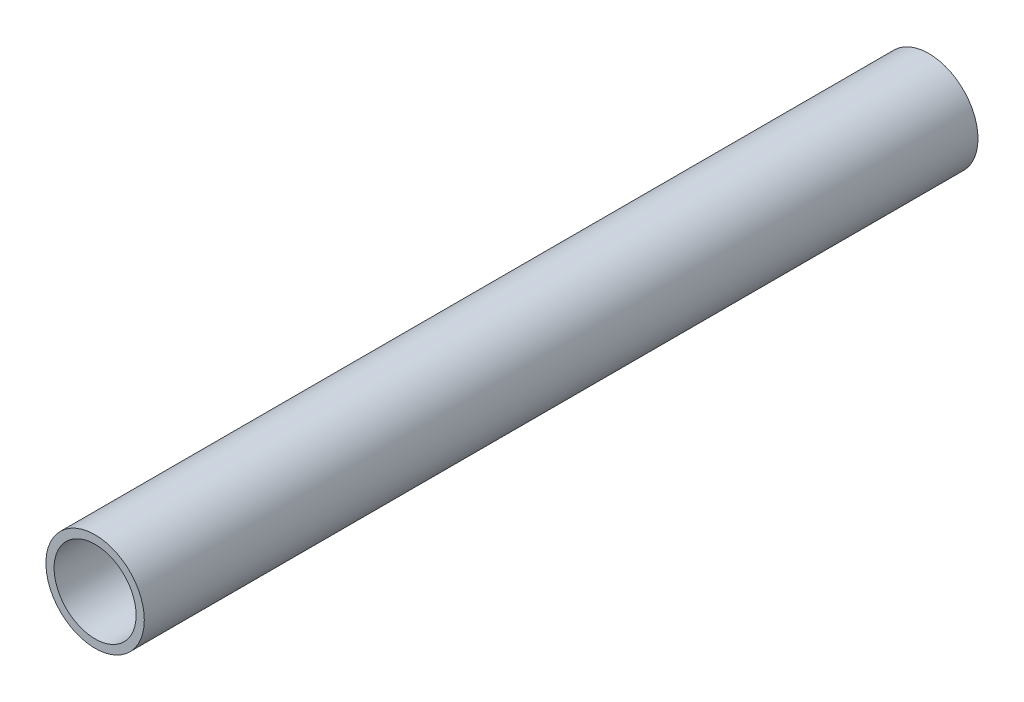
ISO-10303-21;
HEADER;
FILE_DESCRIPTION(('STEP AP214'),'2;1');
FILE_NAME('part.step','',(''),(''),'','','');
FILE_SCHEMA(('AUTOMOTIVE_DESIGN { 1 0 10303 214 1 1 1 1 }'));
ENDSEC;
DATA;
#1=APPLICATION_CONTEXT('core data for automotive mechanical design processes');
#2=APPLICATION_PROTOCOL_DEFINITION('international standard','automotive_design',2000,#1);
#3=PRODUCT_CONTEXT('',#1,'mechanical');
#4=PRODUCT('Part','Part','',(#3));
#5=PRODUCT_RELATED_PRODUCT_CATEGORY('part','',(#4));
#6=PRODUCT_DEFINITION_FORMATION('','',#4);
#7=PRODUCT_DEFINITION_CONTEXT('part definition',#1,'design');
#8=PRODUCT_DEFINITION('design','',#6,#7);
#9=PRODUCT_DEFINITION_SHAPE('','',#8);
#10=(LENGTH_UNIT() NAMED_UNIT(*) SI_UNIT(.MILLI.,.METRE.));
#11=(NAMED_UNIT(*) PLANE_ANGLE_UNIT() SI_UNIT($,.RADIAN.));
#12=(NAMED_UNIT(*) SI_UNIT($,.STERADIAN.) SOLID_ANGLE_UNIT());
#13=UNCERTAINTY_MEASURE_WITH_UNIT(LENGTH_MEASURE(1.E-05),#10,'distance_accuracy_value','');
#14=(GEOMETRIC_REPRESENTATION_CONTEXT(3) GLOBAL_UNCERTAINTY_ASSIGNED_CONTEXT((#13)) GLOBAL_UNIT_ASSIGNED_CONTEXT((#10,
#11,#12)) REPRESENTATION_CONTEXT('',''));
#15=CARTESIAN_POINT('',(0.,0.,0.));
#16=DIRECTION('',(0.,0.,1.));
#17=DIRECTION('',(1.,0.,0.));
#18=AXIS2_PLACEMENT_3D('',#15,#16,#17);
#19=CARTESIAN_POINT('',(0.,0.,305.));
#20=DIRECTION('',(0.,0.,1.));
#21=DIRECTION('',(1.,0.,0.));
#22=AXIS2_PLACEMENT_3D('',#19,#20,#21);
#23=PLANE('',#22);
#24=CARTESIAN_POINT('',(0.,0.,305.));
#25=DIRECTION('',(0.,0.,1.));
#26=DIRECTION('',(1.,0.,0.));
#27=AXIS2_PLACEMENT_3D('',#24,#25,#26);
#28=CIRCLE('',#27,18.);
#29=CARTESIAN_POINT('',(18.,0.,305.));
#30=VERTEX_POINT('',#29);
#31=EDGE_CURVE('E11',#30,#30,#28,.T.);
#32=ORIENTED_EDGE('',*,*,#31,.T.);
#33=EDGE_LOOP('',(#32));
#34=FACE_BOUND('',#33,.T.);
#35=CARTESIAN_POINT('',(0.,0.,305.));
#36=DIRECTION('',(0.,0.,1.));
#37=DIRECTION('',(1.,0.,0.));
#38=AXIS2_PLACEMENT_3D('',#35,#36,#37);
#39=CIRCLE('',#38,15.);
#40=CARTESIAN_POINT('',(15.,0.,305.));
#41=VERTEX_POINT('',#40);
#42=EDGE_CURVE('E48',#41,#41,#39,.T.);
#43=ORIENTED_EDGE('',*,*,#42,.F.);
#44=EDGE_LOOP('',(#43));
#45=FACE_BOUND('',#44,.T.);
#46=ADVANCED_FACE('F37',(#34,#45),#23,.T.);
#47=CARTESIAN_POINT('',(0.,0.,0.));
#48=DIRECTION('',(0.,0.,1.));
#49=DIRECTION('',(1.,0.,0.));
#50=AXIS2_PLACEMENT_3D('',#47,#48,#49);
#51=PLANE('',#50);
#52=CARTESIAN_POINT('',(0.,0.,0.));
#53=DIRECTION('',(0.,0.,1.));
#54=DIRECTION('',(1.,0.,0.));
#55=AXIS2_PLACEMENT_3D('',#52,#53,#54);
#56=CIRCLE('',#55,18.);
#57=CARTESIAN_POINT('',(18.,0.,0.));
#58=VERTEX_POINT('',#57);
#59=EDGE_CURVE('E41',#58,#58,#56,.T.);
#60=ORIENTED_EDGE('',*,*,#59,.F.);
#61=EDGE_LOOP('',(#60));
#62=FACE_BOUND('',#61,.T.);
#63=CARTESIAN_POINT('',(0.,0.,0.));
#64=DIRECTION('',(0.,0.,1.));
#65=DIRECTION('',(1.,0.,0.));
#66=AXIS2_PLACEMENT_3D('',#63,#64,#65);
#67=CIRCLE('',#66,15.);
#68=CARTESIAN_POINT('',(15.,0.,0.));
#69=VERTEX_POINT('',#68);
#70=EDGE_CURVE('E50',#69,#69,#67,.T.);
#71=ORIENTED_EDGE('',*,*,#70,.T.);
#72=EDGE_LOOP('',(#71));
#73=FACE_BOUND('',#72,.T.);
#74=ADVANCED_FACE('F60',(#62,#73),#51,.F.);
#75=CARTESIAN_POINT('',(0.,0.,305.));
#76=DIRECTION('',(0.,0.,-1.));
#77=DIRECTION('',(-1.,0.,0.));
#78=AXIS2_PLACEMENT_3D('',#75,#76,#77);
#79=CYLINDRICAL_SURFACE('',#78,18.);
#80=ORIENTED_EDGE('',*,*,#31,.F.);
#81=EDGE_LOOP('',(#80));
#82=FACE_BOUND('',#81,.T.);
#83=ORIENTED_EDGE('',*,*,#59,.T.);
#84=EDGE_LOOP('',(#83));
#85=FACE_BOUND('',#84,.T.);
#86=ADVANCED_FACE('F39',(#82,#85),#79,.T.);
#87=CARTESIAN_POINT('',(0.,0.,305.));
#88=DIRECTION('',(0.,0.,-1.));
#89=DIRECTION('',(-1.,0.,0.));
#90=AXIS2_PLACEMENT_3D('',#87,#88,#89);
#91=CYLINDRICAL_SURFACE('',#90,15.);
#92=ORIENTED_EDGE('',*,*,#42,.T.);
#93=EDGE_LOOP('',(#92));
#94=FACE_BOUND('',#93,.T.);
#95=ORIENTED_EDGE('',*,*,#70,.F.);
#96=EDGE_LOOP('',(#95));
#97=FACE_BOUND('',#96,.T.);
#98=ADVANCED_FACE('F56',(#94,#97),#91,.F.);
#99=CLOSED_SHELL('',(#46,#74,#86,#98));
#100=MANIFOLD_SOLID_BREP('B2',#99);
#101=ADVANCED_BREP_SHAPE_REPRESENTATION('',(#18,#100),#14);
#102=SHAPE_DEFINITION_REPRESENTATION(#9,#101);
ENDSEC;
END-ISO-10303-21;
